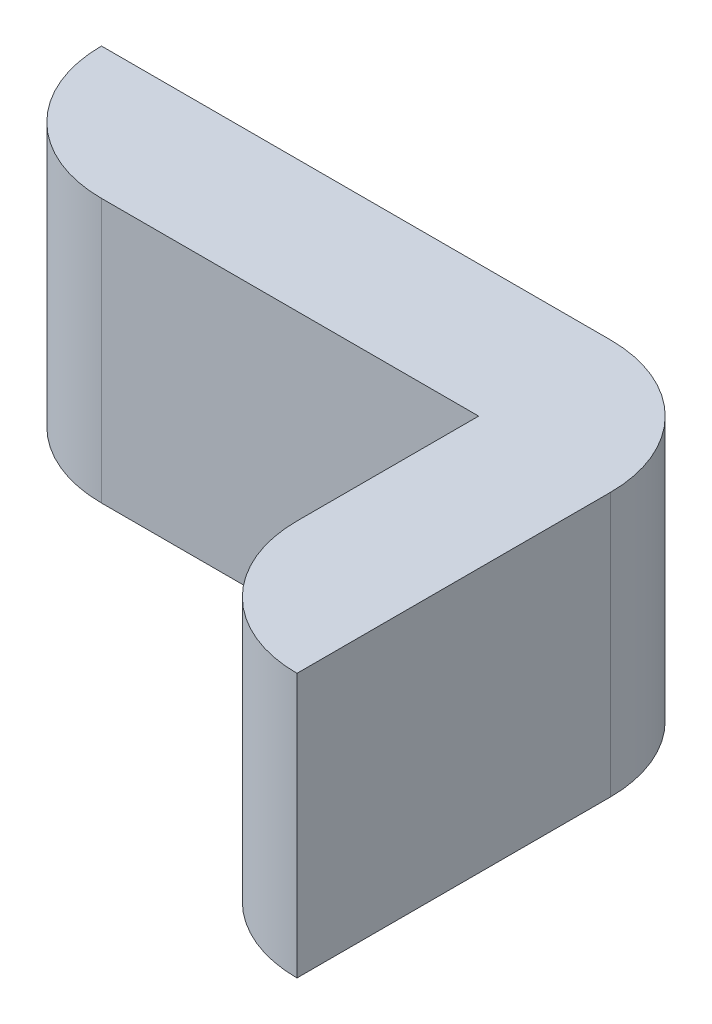
ISO-10303-21;
HEADER;
FILE_DESCRIPTION(('STEP AP214'),'2;1');
FILE_NAME('part.step','',(''),(''),'','','');
FILE_SCHEMA(('AUTOMOTIVE_DESIGN { 1 0 10303 214 1 1 1 1 }'));
ENDSEC;
DATA;
#1=APPLICATION_CONTEXT('core data for automotive mechanical design processes');
#2=APPLICATION_PROTOCOL_DEFINITION('international standard','automotive_design',2000,#1);
#3=PRODUCT_CONTEXT('',#1,'mechanical');
#4=PRODUCT('Part','Part','',(#3));
#5=PRODUCT_RELATED_PRODUCT_CATEGORY('part','',(#4));
#6=PRODUCT_DEFINITION_FORMATION('','',#4);
#7=PRODUCT_DEFINITION_CONTEXT('part definition',#1,'design');
#8=PRODUCT_DEFINITION('design','',#6,#7);
#9=PRODUCT_DEFINITION_SHAPE('','',#8);
#10=(LENGTH_UNIT() NAMED_UNIT(*) SI_UNIT(.MILLI.,.METRE.));
#11=(NAMED_UNIT(*) PLANE_ANGLE_UNIT() SI_UNIT($,.RADIAN.));
#12=(NAMED_UNIT(*) SI_UNIT($,.STERADIAN.) SOLID_ANGLE_UNIT());
#13=UNCERTAINTY_MEASURE_WITH_UNIT(LENGTH_MEASURE(1.E-05),#10,'distance_accuracy_value','');
#14=(GEOMETRIC_REPRESENTATION_CONTEXT(3) GLOBAL_UNCERTAINTY_ASSIGNED_CONTEXT((#13)) GLOBAL_UNIT_ASSIGNED_CONTEXT((#10,
#11,#12)) REPRESENTATION_CONTEXT('',''));
#15=CARTESIAN_POINT('',(0.,0.,0.));
#16=DIRECTION('',(0.,0.,1.));
#17=DIRECTION('',(1.,0.,0.));
#18=AXIS2_PLACEMENT_3D('',#15,#16,#17);
#19=CARTESIAN_POINT('',(-4.7,-3.4294,0.7747));
#20=DIRECTION('',(-1.,0.,0.));
#21=DIRECTION('',(0.,0.,1.));
#22=AXIS2_PLACEMENT_3D('',#19,#20,#21);
#23=PLANE('',#22);
#24=DIRECTION('',(0.,0.,-1.));
#25=VECTOR('',#24,1.);
#26=CARTESIAN_POINT('',(-4.7,-3.4294,0.));
#27=LINE('',#26,#25);
#28=CARTESIAN_POINT('',(-4.7,-3.4294,0.2294));
#29=VERTEX_POINT('',#28);
#30=CARTESIAN_POINT('',(-4.7,-3.4294,0.7747));
#31=VERTEX_POINT('',#30);
#32=EDGE_CURVE('E129',#29,#31,#27,.F.);
#33=ORIENTED_EDGE('',*,*,#32,.F.);
#34=DIRECTION('',(0.,-1.,0.));
#35=VECTOR('',#34,1.);
#36=CARTESIAN_POINT('',(-4.7,-3.4294,0.2294));
#37=LINE('',#36,#35);
#38=CARTESIAN_POINT('',(-4.7,-2.9706,0.2294));
#39=VERTEX_POINT('',#38);
#40=EDGE_CURVE('E82',#39,#29,#37,.T.);
#41=ORIENTED_EDGE('',*,*,#40,.F.);
#42=DIRECTION('',(0.,0.,-1.));
#43=VECTOR('',#42,1.);
#44=CARTESIAN_POINT('',(-4.7,-2.9706,0.));
#45=LINE('',#44,#43);
#46=CARTESIAN_POINT('',(-4.7,-2.9706,0.7747));
#47=VERTEX_POINT('',#46);
#48=EDGE_CURVE('E77',#39,#47,#45,.F.);
#49=ORIENTED_EDGE('',*,*,#48,.T.);
#50=DIRECTION('',(0.,-1.,0.));
#51=VECTOR('',#50,1.);
#52=CARTESIAN_POINT('',(-4.7,-3.4294,0.7747));
#53=LINE('',#52,#51);
#54=EDGE_CURVE('E123',#31,#47,#53,.F.);
#55=ORIENTED_EDGE('',*,*,#54,.F.);
#56=EDGE_LOOP('',(#33,#41,#49,#55));
#57=FACE_BOUND('',#56,.T.);
#58=ADVANCED_FACE('F17',(#57),#23,.F.);
#59=CARTESIAN_POINT('',(-4.7,-3.4294,0.5453));
#60=DIRECTION('',(0.,-1.,0.));
#61=DIRECTION('',(0.,0.,-1.));
#62=AXIS2_PLACEMENT_3D('',#59,#60,#61);
#63=CYLINDRICAL_SURFACE('',#62,0.2294);
#64=CARTESIAN_POINT('',(-4.7,-2.9706,0.5453));
#65=DIRECTION('',(0.,-1.,0.));
#66=DIRECTION('',(0.,0.,-1.));
#67=AXIS2_PLACEMENT_3D('',#64,#65,#66);
#68=CIRCLE('',#67,0.2294);
#69=CARTESIAN_POINT('',(-4.9294,-2.9706,0.5453));
#70=VERTEX_POINT('',#69);
#71=EDGE_CURVE('E107',#47,#70,#68,.T.);
#72=ORIENTED_EDGE('',*,*,#71,.T.);
#73=DIRECTION('',(0.,1.,0.));
#74=VECTOR('',#73,1.);
#75=CARTESIAN_POINT('',(-4.9294,-3.4294,0.5453));
#76=LINE('',#75,#74);
#77=CARTESIAN_POINT('',(-4.9294,-3.4294,0.5453));
#78=VERTEX_POINT('',#77);
#79=EDGE_CURVE('E118',#70,#78,#76,.F.);
#80=ORIENTED_EDGE('',*,*,#79,.T.);
#81=CARTESIAN_POINT('',(-4.7,-3.4294,0.5453));
#82=DIRECTION('',(0.,-1.,0.));
#83=DIRECTION('',(0.,0.,-1.));
#84=AXIS2_PLACEMENT_3D('',#81,#82,#83);
#85=CIRCLE('',#84,0.2294);
#86=EDGE_CURVE('E126',#31,#78,#85,.T.);
#87=ORIENTED_EDGE('',*,*,#86,.F.);
#88=ORIENTED_EDGE('',*,*,#54,.T.);
#89=EDGE_LOOP('',(#72,#80,#87,#88));
#90=FACE_BOUND('',#89,.T.);
#91=ADVANCED_FACE('F133',(#90),#63,.T.);
#92=CARTESIAN_POINT('',(-4.9294,-3.4294,0.2294));
#93=DIRECTION('',(1.,0.,0.));
#94=DIRECTION('',(0.,0.,-1.));
#95=AXIS2_PLACEMENT_3D('',#92,#93,#94);
#96=PLANE('',#95);
#97=ORIENTED_EDGE('',*,*,#79,.F.);
#98=DIRECTION('',(0.,0.,-1.));
#99=VECTOR('',#98,1.);
#100=CARTESIAN_POINT('',(-4.9294,-2.9706,0.));
#101=LINE('',#100,#99);
#102=CARTESIAN_POINT('',(-4.9294,-2.9706,0.2294));
#103=VERTEX_POINT('',#102);
#104=EDGE_CURVE('E102',#70,#103,#101,.T.);
#105=ORIENTED_EDGE('',*,*,#104,.T.);
#106=DIRECTION('',(0.,1.,0.));
#107=VECTOR('',#106,1.);
#108=CARTESIAN_POINT('',(-4.9294,-3.4294,0.2294));
#109=LINE('',#108,#107);
#110=CARTESIAN_POINT('',(-4.9294,-3.4294,0.2294));
#111=VERTEX_POINT('',#110);
#112=EDGE_CURVE('E115',#103,#111,#109,.F.);
#113=ORIENTED_EDGE('',*,*,#112,.T.);
#114=DIRECTION('',(0.,0.,-1.));
#115=VECTOR('',#114,1.);
#116=CARTESIAN_POINT('',(-4.9294,-3.4294,0.));
#117=LINE('',#116,#115);
#118=EDGE_CURVE('E128',#78,#111,#117,.T.);
#119=ORIENTED_EDGE('',*,*,#118,.F.);
#120=EDGE_LOOP('',(#97,#105,#113,#119));
#121=FACE_BOUND('',#120,.T.);
#122=ADVANCED_FACE('F158',(#121),#96,.F.);
#123=CARTESIAN_POINT('',(-5.5853,-3.4294,0.2294));
#124=DIRECTION('',(0.,0.,-1.));
#125=DIRECTION('',(-1.,0.,0.));
#126=AXIS2_PLACEMENT_3D('',#123,#124,#125);
#127=PLANE('',#126);
#128=ORIENTED_EDGE('',*,*,#112,.F.);
#129=DIRECTION('',(1.,0.,0.));
#130=VECTOR('',#129,1.);
#131=CARTESIAN_POINT('',(-5.8147,-2.9706,0.2294));
#132=LINE('',#131,#130);
#133=CARTESIAN_POINT('',(-5.5853,-2.9706,0.2294));
#134=VERTEX_POINT('',#133);
#135=EDGE_CURVE('E98',#103,#134,#132,.F.);
#136=ORIENTED_EDGE('',*,*,#135,.T.);
#137=DIRECTION('',(0.,-1.,0.));
#138=VECTOR('',#137,1.);
#139=CARTESIAN_POINT('',(-5.5853,-3.4294,0.2294));
#140=LINE('',#139,#138);
#141=CARTESIAN_POINT('',(-5.5853,-3.4294,0.2294));
#142=VERTEX_POINT('',#141);
#143=EDGE_CURVE('E101',#142,#134,#140,.F.);
#144=ORIENTED_EDGE('',*,*,#143,.F.);
#145=DIRECTION('',(1.,0.,0.));
#146=VECTOR('',#145,1.);
#147=CARTESIAN_POINT('',(-5.8147,-3.4294,0.2294));
#148=LINE('',#147,#146);
#149=EDGE_CURVE('E94',#111,#142,#148,.F.);
#150=ORIENTED_EDGE('',*,*,#149,.F.);
#151=EDGE_LOOP('',(#128,#136,#144,#150));
#152=FACE_BOUND('',#151,.T.);
#153=ADVANCED_FACE('F156',(#152),#127,.F.);
#154=CARTESIAN_POINT('',(-4.9294,-3.4294,0.2294));
#155=DIRECTION('',(0.,-1.,0.));
#156=DIRECTION('',(0.,0.,-1.));
#157=AXIS2_PLACEMENT_3D('',#154,#155,#156);
#158=CYLINDRICAL_SURFACE('',#157,0.2294);
#159=CARTESIAN_POINT('',(-4.9294,-2.9706,0.2294));
#160=DIRECTION('',(0.,-1.,0.));
#161=DIRECTION('',(0.,0.,-1.));
#162=AXIS2_PLACEMENT_3D('',#159,#160,#161);
#163=CIRCLE('',#162,0.2294);
#164=CARTESIAN_POINT('',(-4.9294,-2.9706,0.));
#165=VERTEX_POINT('',#164);
#166=EDGE_CURVE('E20',#165,#39,#163,.T.);
#167=ORIENTED_EDGE('',*,*,#166,.T.);
#168=ORIENTED_EDGE('',*,*,#40,.T.);
#169=CARTESIAN_POINT('',(-4.9294,-3.4294,0.2294));
#170=DIRECTION('',(0.,-1.,0.));
#171=DIRECTION('',(0.,0.,-1.));
#172=AXIS2_PLACEMENT_3D('',#169,#170,#171);
#173=CIRCLE('',#172,0.2294);
#174=CARTESIAN_POINT('',(-4.9294,-3.4294,0.));
#175=VERTEX_POINT('',#174);
#176=EDGE_CURVE('E92',#175,#29,#173,.T.);
#177=ORIENTED_EDGE('',*,*,#176,.F.);
#178=DIRECTION('',(0.,1.,0.));
#179=VECTOR('',#178,1.);
#180=CARTESIAN_POINT('',(-4.9294,-3.4294,0.));
#181=LINE('',#180,#179);
#182=EDGE_CURVE('E86',#175,#165,#181,.T.);
#183=ORIENTED_EDGE('',*,*,#182,.T.);
#184=EDGE_LOOP('',(#167,#168,#177,#183));
#185=FACE_BOUND('',#184,.T.);
#186=ADVANCED_FACE('F90',(#185),#158,.T.);
#187=CARTESIAN_POINT('',(-5.8147,-2.9706,0.));
#188=DIRECTION('',(0.,-1.,0.));
#189=DIRECTION('',(0.,0.,-1.));
#190=AXIS2_PLACEMENT_3D('',#187,#188,#189);
#191=PLANE('',#190);
#192=ORIENTED_EDGE('',*,*,#135,.F.);
#193=ORIENTED_EDGE('',*,*,#104,.F.);
#194=ORIENTED_EDGE('',*,*,#71,.F.);
#195=ORIENTED_EDGE('',*,*,#48,.F.);
#196=ORIENTED_EDGE('',*,*,#166,.F.);
#197=DIRECTION('',(1.,0.,0.));
#198=VECTOR('',#197,1.);
#199=CARTESIAN_POINT('',(-4.9294,-2.9706,0.));
#200=LINE('',#199,#198);
#201=CARTESIAN_POINT('',(-5.8147,-2.9706,0.));
#202=VERTEX_POINT('',#201);
#203=EDGE_CURVE('E74',#165,#202,#200,.F.);
#204=ORIENTED_EDGE('',*,*,#203,.T.);
#205=CARTESIAN_POINT('',(-5.5853,-2.9706,0.));
#206=DIRECTION('',(0.,-1.,0.));
#207=DIRECTION('',(0.,0.,-1.));
#208=AXIS2_PLACEMENT_3D('',#205,#206,#207);
#209=CIRCLE('',#208,0.2294);
#210=EDGE_CURVE('E114',#134,#202,#209,.T.);
#211=ORIENTED_EDGE('',*,*,#210,.F.);
#212=EDGE_LOOP('',(#192,#193,#194,#195,#196,#204,#211));
#213=FACE_BOUND('',#212,.T.);
#214=ADVANCED_FACE('F72',(#213),#191,.F.);
#215=CARTESIAN_POINT('',(-5.5853,-3.4294,0.));
#216=DIRECTION('',(0.,-1.,0.));
#217=DIRECTION('',(0.,0.,-1.));
#218=AXIS2_PLACEMENT_3D('',#215,#216,#217);
#219=CYLINDRICAL_SURFACE('',#218,0.2294);
#220=ORIENTED_EDGE('',*,*,#210,.T.);
#221=DIRECTION('',(0.,1.,0.));
#222=VECTOR('',#221,1.);
#223=CARTESIAN_POINT('',(-5.8147,-3.4294,0.));
#224=LINE('',#223,#222);
#225=CARTESIAN_POINT('',(-5.8147,-3.4294,0.));
#226=VERTEX_POINT('',#225);
#227=EDGE_CURVE('E26',#202,#226,#224,.F.);
#228=ORIENTED_EDGE('',*,*,#227,.T.);
#229=CARTESIAN_POINT('',(-5.5853,-3.4294,0.));
#230=DIRECTION('',(0.,-1.,0.));
#231=DIRECTION('',(0.,0.,-1.));
#232=AXIS2_PLACEMENT_3D('',#229,#230,#231);
#233=CIRCLE('',#232,0.2294);
#234=EDGE_CURVE('E34',#142,#226,#233,.T.);
#235=ORIENTED_EDGE('',*,*,#234,.F.);
#236=ORIENTED_EDGE('',*,*,#143,.T.);
#237=EDGE_LOOP('',(#220,#228,#235,#236));
#238=FACE_BOUND('',#237,.T.);
#239=ADVANCED_FACE('F141',(#238),#219,.T.);
#240=CARTESIAN_POINT('',(-5.8147,-3.4294,0.));
#241=DIRECTION('',(0.,-1.,0.));
#242=DIRECTION('',(0.,0.,-1.));
#243=AXIS2_PLACEMENT_3D('',#240,#241,#242);
#244=PLANE('',#243);
#245=ORIENTED_EDGE('',*,*,#149,.T.);
#246=ORIENTED_EDGE('',*,*,#234,.T.);
#247=DIRECTION('',(1.,0.,0.));
#248=VECTOR('',#247,1.);
#249=CARTESIAN_POINT('',(-4.9294,-3.4294,0.));
#250=LINE('',#249,#248);
#251=EDGE_CURVE('E11',#226,#175,#250,.T.);
#252=ORIENTED_EDGE('',*,*,#251,.T.);
#253=ORIENTED_EDGE('',*,*,#176,.T.);
#254=ORIENTED_EDGE('',*,*,#32,.T.);
#255=ORIENTED_EDGE('',*,*,#86,.T.);
#256=ORIENTED_EDGE('',*,*,#118,.T.);
#257=EDGE_LOOP('',(#245,#246,#252,#253,#254,#255,#256));
#258=FACE_BOUND('',#257,.T.);
#259=ADVANCED_FACE('F139',(#258),#244,.T.);
#260=CARTESIAN_POINT('',(-4.9294,-3.4294,0.));
#261=DIRECTION('',(0.,0.,1.));
#262=DIRECTION('',(1.,0.,0.));
#263=AXIS2_PLACEMENT_3D('',#260,#261,#262);
#264=PLANE('',#263);
#265=ORIENTED_EDGE('',*,*,#227,.F.);
#266=ORIENTED_EDGE('',*,*,#203,.F.);
#267=ORIENTED_EDGE('',*,*,#182,.F.);
#268=ORIENTED_EDGE('',*,*,#251,.F.);
#269=EDGE_LOOP('',(#265,#266,#267,#268));
#270=FACE_BOUND('',#269,.T.);
#271=ADVANCED_FACE('F85',(#270),#264,.F.);
#272=CLOSED_SHELL('',(#58,#91,#122,#153,#186,#214,#239,#259,#271));
#273=MANIFOLD_SOLID_BREP('B1',#272);
#274=ADVANCED_BREP_SHAPE_REPRESENTATION('',(#18,#273),#14);
#275=SHAPE_DEFINITION_REPRESENTATION(#9,#274);
ENDSEC;
END-ISO-10303-21;
